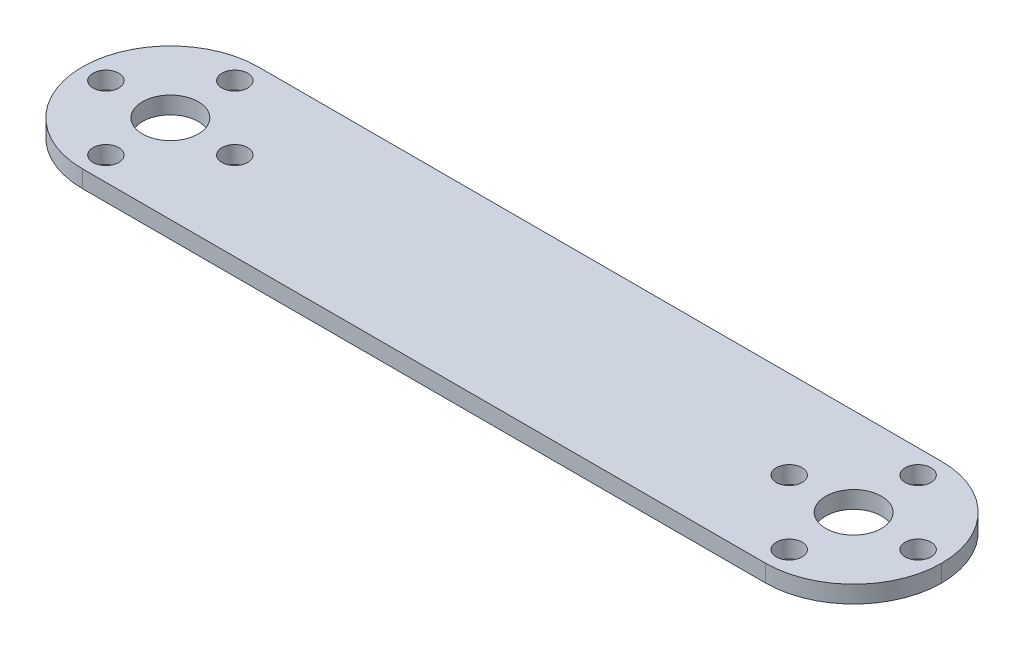
ISO-10303-21;
HEADER;
FILE_DESCRIPTION(('STEP AP214'),'2;1');
FILE_NAME('part.step','',(''),(''),'','','');
FILE_SCHEMA(('AUTOMOTIVE_DESIGN { 1 0 10303 214 1 1 1 1 }'));
ENDSEC;
DATA;
#1=APPLICATION_CONTEXT('core data for automotive mechanical design processes');
#2=APPLICATION_PROTOCOL_DEFINITION('international standard','automotive_design',2000,#1);
#3=PRODUCT_CONTEXT('',#1,'mechanical');
#4=PRODUCT('Part','Part','',(#3));
#5=PRODUCT_RELATED_PRODUCT_CATEGORY('part','',(#4));
#6=PRODUCT_DEFINITION_FORMATION('','',#4);
#7=PRODUCT_DEFINITION_CONTEXT('part definition',#1,'design');
#8=PRODUCT_DEFINITION('design','',#6,#7);
#9=PRODUCT_DEFINITION_SHAPE('','',#8);
#10=(LENGTH_UNIT() NAMED_UNIT(*) SI_UNIT(.MILLI.,.METRE.));
#11=(NAMED_UNIT(*) PLANE_ANGLE_UNIT() SI_UNIT($,.RADIAN.));
#12=(NAMED_UNIT(*) SI_UNIT($,.STERADIAN.) SOLID_ANGLE_UNIT());
#13=UNCERTAINTY_MEASURE_WITH_UNIT(LENGTH_MEASURE(1.E-05),#10,'distance_accuracy_value','');
#14=(GEOMETRIC_REPRESENTATION_CONTEXT(3) GLOBAL_UNCERTAINTY_ASSIGNED_CONTEXT((#13)) GLOBAL_UNIT_ASSIGNED_CONTEXT((#10,
#11,#12)) REPRESENTATION_CONTEXT('',''));
#15=CARTESIAN_POINT('',(0.,0.,0.));
#16=DIRECTION('',(0.,0.,1.));
#17=DIRECTION('',(1.,0.,0.));
#18=AXIS2_PLACEMENT_3D('',#15,#16,#17);
#19=CARTESIAN_POINT('',(0.,2.,0.));
#20=DIRECTION('',(0.,-1.,0.));
#21=DIRECTION('',(0.,0.,-1.));
#22=AXIS2_PLACEMENT_3D('',#19,#20,#21);
#23=PLANE('',#22);
#24=CARTESIAN_POINT('',(10.25,2.,-10.25));
#25=DIRECTION('',(0.,-1.,0.));
#26=DIRECTION('',(0.,0.,-1.));
#27=AXIS2_PLACEMENT_3D('',#24,#25,#26);
#28=CIRCLE('',#27,10.25);
#29=CARTESIAN_POINT('',(10.25,2.,-20.5));
#30=VERTEX_POINT('',#29);
#31=CARTESIAN_POINT('',(0.,2.,-10.25));
#32=VERTEX_POINT('',#31);
#33=EDGE_CURVE('E132',#30,#32,#28,.F.);
#34=ORIENTED_EDGE('',*,*,#33,.T.);
#35=CARTESIAN_POINT('',(10.25,2.,-10.25));
#36=DIRECTION('',(0.,-1.,0.));
#37=DIRECTION('',(0.,0.,-1.));
#38=AXIS2_PLACEMENT_3D('',#35,#36,#37);
#39=CIRCLE('',#38,10.25);
#40=CARTESIAN_POINT('',(10.25,2.,0.));
#41=VERTEX_POINT('',#40);
#42=EDGE_CURVE('E134',#32,#41,#39,.F.);
#43=ORIENTED_EDGE('',*,*,#42,.T.);
#44=DIRECTION('',(1.,0.,0.));
#45=VECTOR('',#44,1.);
#46=CARTESIAN_POINT('',(0.,2.,0.));
#47=LINE('',#46,#45);
#48=CARTESIAN_POINT('',(89.75,2.,0.));
#49=VERTEX_POINT('',#48);
#50=EDGE_CURVE('E107',#41,#49,#47,.T.);
#51=ORIENTED_EDGE('',*,*,#50,.T.);
#52=CARTESIAN_POINT('',(89.75,2.,-10.25));
#53=DIRECTION('',(0.,-1.,0.));
#54=DIRECTION('',(0.,0.,-1.));
#55=AXIS2_PLACEMENT_3D('',#52,#53,#54);
#56=CIRCLE('',#55,10.25);
#57=CARTESIAN_POINT('',(100.,2.,-10.25));
#58=VERTEX_POINT('',#57);
#59=EDGE_CURVE('E97',#49,#58,#56,.F.);
#60=ORIENTED_EDGE('',*,*,#59,.T.);
#61=CARTESIAN_POINT('',(89.75,2.,-10.25));
#62=DIRECTION('',(0.,-1.,0.));
#63=DIRECTION('',(0.,0.,-1.));
#64=AXIS2_PLACEMENT_3D('',#61,#62,#63);
#65=CIRCLE('',#64,10.25);
#66=CARTESIAN_POINT('',(89.75,2.,-20.5));
#67=VERTEX_POINT('',#66);
#68=EDGE_CURVE('E55',#58,#67,#65,.F.);
#69=ORIENTED_EDGE('',*,*,#68,.T.);
#70=DIRECTION('',(-1.,0.,0.));
#71=VECTOR('',#70,1.);
#72=CARTESIAN_POINT('',(0.,2.,-20.5));
#73=LINE('',#72,#71);
#74=EDGE_CURVE('E122',#67,#30,#73,.T.);
#75=ORIENTED_EDGE('',*,*,#74,.T.);
#76=EDGE_LOOP('',(#34,#43,#51,#60,#69,#75));
#77=FACE_BOUND('',#76,.T.);
#78=CARTESIAN_POINT('',(10.25,2.,-10.25));
#79=DIRECTION('',(0.,1.,0.));
#80=DIRECTION('',(0.,0.,1.));
#81=AXIS2_PLACEMENT_3D('',#78,#79,#80);
#82=CIRCLE('',#81,3.25);
#83=CARTESIAN_POINT('',(10.25,2.,-7.));
#84=VERTEX_POINT('',#83);
#85=EDGE_CURVE('E115',#84,#84,#82,.T.);
#86=ORIENTED_EDGE('',*,*,#85,.F.);
#87=EDGE_LOOP('',(#86));
#88=FACE_BOUND('',#87,.T.);
#89=CARTESIAN_POINT('',(17.75,2.,-10.25));
#90=DIRECTION('',(0.,1.,0.));
#91=DIRECTION('',(0.,0.,1.));
#92=AXIS2_PLACEMENT_3D('',#89,#90,#91);
#93=CIRCLE('',#92,1.5);
#94=CARTESIAN_POINT('',(17.75,2.,-8.75));
#95=VERTEX_POINT('',#94);
#96=EDGE_CURVE('E151',#95,#95,#93,.T.);
#97=ORIENTED_EDGE('',*,*,#96,.F.);
#98=EDGE_LOOP('',(#97));
#99=FACE_BOUND('',#98,.T.);
#100=CARTESIAN_POINT('',(10.25,2.,-17.75));
#101=DIRECTION('',(0.,1.,0.));
#102=DIRECTION('',(0.,0.,-1.));
#103=AXIS2_PLACEMENT_3D('',#100,#101,#102);
#104=CIRCLE('',#103,1.5);
#105=CARTESIAN_POINT('',(10.25,2.,-19.25));
#106=VERTEX_POINT('',#105);
#107=EDGE_CURVE('E156',#106,#106,#104,.T.);
#108=ORIENTED_EDGE('',*,*,#107,.F.);
#109=EDGE_LOOP('',(#108));
#110=FACE_BOUND('',#109,.T.);
#111=CARTESIAN_POINT('',(10.25,2.,-2.75));
#112=DIRECTION('',(0.,1.,0.));
#113=DIRECTION('',(0.,0.,-1.));
#114=AXIS2_PLACEMENT_3D('',#111,#112,#113);
#115=CIRCLE('',#114,1.5);
#116=CARTESIAN_POINT('',(10.25,2.,-4.25));
#117=VERTEX_POINT('',#116);
#118=EDGE_CURVE('E162',#117,#117,#115,.T.);
#119=ORIENTED_EDGE('',*,*,#118,.F.);
#120=EDGE_LOOP('',(#119));
#121=FACE_BOUND('',#120,.T.);
#122=CARTESIAN_POINT('',(2.75,2.,-10.25));
#123=DIRECTION('',(0.,1.,0.));
#124=DIRECTION('',(0.,0.,1.));
#125=AXIS2_PLACEMENT_3D('',#122,#123,#124);
#126=CIRCLE('',#125,1.5);
#127=CARTESIAN_POINT('',(2.75,2.,-8.75));
#128=VERTEX_POINT('',#127);
#129=EDGE_CURVE('E168',#128,#128,#126,.T.);
#130=ORIENTED_EDGE('',*,*,#129,.F.);
#131=EDGE_LOOP('',(#130));
#132=FACE_BOUND('',#131,.T.);
#133=CARTESIAN_POINT('',(82.25,2.,-10.25));
#134=DIRECTION('',(0.,1.,0.));
#135=DIRECTION('',(0.,0.,-1.));
#136=AXIS2_PLACEMENT_3D('',#133,#134,#135);
#137=CIRCLE('',#136,1.5);
#138=CARTESIAN_POINT('',(82.25,2.,-11.75));
#139=VERTEX_POINT('',#138);
#140=EDGE_CURVE('E174',#139,#139,#137,.T.);
#141=ORIENTED_EDGE('',*,*,#140,.F.);
#142=EDGE_LOOP('',(#141));
#143=FACE_BOUND('',#142,.T.);
#144=CARTESIAN_POINT('',(89.75,2.,-17.75));
#145=DIRECTION('',(0.,1.,0.));
#146=DIRECTION('',(0.,0.,1.));
#147=AXIS2_PLACEMENT_3D('',#144,#145,#146);
#148=CIRCLE('',#147,1.5);
#149=CARTESIAN_POINT('',(89.75,2.,-16.25));
#150=VERTEX_POINT('',#149);
#151=EDGE_CURVE('E180',#150,#150,#148,.T.);
#152=ORIENTED_EDGE('',*,*,#151,.F.);
#153=EDGE_LOOP('',(#152));
#154=FACE_BOUND('',#153,.T.);
#155=CARTESIAN_POINT('',(89.75,2.,-2.75));
#156=DIRECTION('',(0.,1.,0.));
#157=DIRECTION('',(0.,0.,1.));
#158=AXIS2_PLACEMENT_3D('',#155,#156,#157);
#159=CIRCLE('',#158,1.5);
#160=CARTESIAN_POINT('',(89.75,2.,-1.25));
#161=VERTEX_POINT('',#160);
#162=EDGE_CURVE('E186',#161,#161,#159,.T.);
#163=ORIENTED_EDGE('',*,*,#162,.F.);
#164=EDGE_LOOP('',(#163));
#165=FACE_BOUND('',#164,.T.);
#166=CARTESIAN_POINT('',(97.25,2.,-10.25));
#167=DIRECTION('',(0.,1.,0.));
#168=DIRECTION('',(0.,0.,-1.));
#169=AXIS2_PLACEMENT_3D('',#166,#167,#168);
#170=CIRCLE('',#169,1.5);
#171=CARTESIAN_POINT('',(97.25,2.,-11.75));
#172=VERTEX_POINT('',#171);
#173=EDGE_CURVE('E192',#172,#172,#170,.T.);
#174=ORIENTED_EDGE('',*,*,#173,.F.);
#175=EDGE_LOOP('',(#174));
#176=FACE_BOUND('',#175,.T.);
#177=CARTESIAN_POINT('',(89.75,2.,-10.25));
#178=DIRECTION('',(0.,1.,0.));
#179=DIRECTION('',(0.,0.,-1.));
#180=AXIS2_PLACEMENT_3D('',#177,#178,#179);
#181=CIRCLE('',#180,3.24999999999999);
#182=CARTESIAN_POINT('',(89.75,2.,-13.5));
#183=VERTEX_POINT('',#182);
#184=EDGE_CURVE('E139',#183,#183,#181,.T.);
#185=ORIENTED_EDGE('',*,*,#184,.F.);
#186=EDGE_LOOP('',(#185));
#187=FACE_BOUND('',#186,.T.);
#188=ADVANCED_FACE('F33',(#77,#88,#99,#110,#121,#132,#143,#154,#165,#176,#187),#23,.F.);
#189=CARTESIAN_POINT('',(0.,0.,0.));
#190=DIRECTION('',(0.,-1.,0.));
#191=DIRECTION('',(0.,0.,-1.));
#192=AXIS2_PLACEMENT_3D('',#189,#190,#191);
#193=PLANE('',#192);
#194=CARTESIAN_POINT('',(97.25,0.,-10.25));
#195=DIRECTION('',(0.,1.,0.));
#196=DIRECTION('',(0.,0.,-1.));
#197=AXIS2_PLACEMENT_3D('',#194,#195,#196);
#198=CIRCLE('',#197,1.5);
#199=CARTESIAN_POINT('',(97.25,0.,-11.75));
#200=VERTEX_POINT('',#199);
#201=EDGE_CURVE('E195',#200,#200,#198,.T.);
#202=ORIENTED_EDGE('',*,*,#201,.T.);
#203=EDGE_LOOP('',(#202));
#204=FACE_BOUND('',#203,.T.);
#205=CARTESIAN_POINT('',(89.75,0.,-17.75));
#206=DIRECTION('',(0.,1.,0.));
#207=DIRECTION('',(0.,0.,1.));
#208=AXIS2_PLACEMENT_3D('',#205,#206,#207);
#209=CIRCLE('',#208,1.5);
#210=CARTESIAN_POINT('',(89.75,0.,-16.25));
#211=VERTEX_POINT('',#210);
#212=EDGE_CURVE('E183',#211,#211,#209,.T.);
#213=ORIENTED_EDGE('',*,*,#212,.T.);
#214=EDGE_LOOP('',(#213));
#215=FACE_BOUND('',#214,.T.);
#216=CARTESIAN_POINT('',(2.75,0.,-10.25));
#217=DIRECTION('',(0.,1.,0.));
#218=DIRECTION('',(0.,0.,1.));
#219=AXIS2_PLACEMENT_3D('',#216,#217,#218);
#220=CIRCLE('',#219,1.5);
#221=CARTESIAN_POINT('',(2.75,0.,-8.75));
#222=VERTEX_POINT('',#221);
#223=EDGE_CURVE('E171',#222,#222,#220,.T.);
#224=ORIENTED_EDGE('',*,*,#223,.T.);
#225=EDGE_LOOP('',(#224));
#226=FACE_BOUND('',#225,.T.);
#227=CARTESIAN_POINT('',(10.25,0.,-17.75));
#228=DIRECTION('',(0.,1.,0.));
#229=DIRECTION('',(0.,0.,-1.));
#230=AXIS2_PLACEMENT_3D('',#227,#228,#229);
#231=CIRCLE('',#230,1.5);
#232=CARTESIAN_POINT('',(10.25,0.,-19.25));
#233=VERTEX_POINT('',#232);
#234=EDGE_CURVE('E159',#233,#233,#231,.T.);
#235=ORIENTED_EDGE('',*,*,#234,.T.);
#236=EDGE_LOOP('',(#235));
#237=FACE_BOUND('',#236,.T.);
#238=CARTESIAN_POINT('',(10.25,0.,-10.25));
#239=DIRECTION('',(0.,1.,0.));
#240=DIRECTION('',(0.,0.,1.));
#241=AXIS2_PLACEMENT_3D('',#238,#239,#240);
#242=CIRCLE('',#241,3.25);
#243=CARTESIAN_POINT('',(10.25,0.,-7.));
#244=VERTEX_POINT('',#243);
#245=EDGE_CURVE('E119',#244,#244,#242,.T.);
#246=ORIENTED_EDGE('',*,*,#245,.T.);
#247=EDGE_LOOP('',(#246));
#248=FACE_BOUND('',#247,.T.);
#249=DIRECTION('',(1.,0.,0.));
#250=VECTOR('',#249,1.);
#251=CARTESIAN_POINT('',(0.,0.,0.));
#252=LINE('',#251,#250);
#253=CARTESIAN_POINT('',(10.25,0.,0.));
#254=VERTEX_POINT('',#253);
#255=CARTESIAN_POINT('',(89.75,0.,0.));
#256=VERTEX_POINT('',#255);
#257=EDGE_CURVE('E104',#254,#256,#252,.T.);
#258=ORIENTED_EDGE('',*,*,#257,.F.);
#259=CARTESIAN_POINT('',(10.25,0.,-10.25));
#260=DIRECTION('',(0.,-1.,0.));
#261=DIRECTION('',(0.,0.,-1.));
#262=AXIS2_PLACEMENT_3D('',#259,#260,#261);
#263=CIRCLE('',#262,10.25);
#264=CARTESIAN_POINT('',(0.,0.,-10.25));
#265=VERTEX_POINT('',#264);
#266=EDGE_CURVE('E87',#254,#265,#263,.T.);
#267=ORIENTED_EDGE('',*,*,#266,.T.);
#268=CARTESIAN_POINT('',(10.25,0.,-10.25));
#269=DIRECTION('',(0.,-1.,0.));
#270=DIRECTION('',(0.,0.,-1.));
#271=AXIS2_PLACEMENT_3D('',#268,#269,#270);
#272=CIRCLE('',#271,10.25);
#273=CARTESIAN_POINT('',(10.25,0.,-20.5));
#274=VERTEX_POINT('',#273);
#275=EDGE_CURVE('E98',#265,#274,#272,.T.);
#276=ORIENTED_EDGE('',*,*,#275,.T.);
#277=DIRECTION('',(-1.,0.,0.));
#278=VECTOR('',#277,1.);
#279=CARTESIAN_POINT('',(0.,0.,-20.5));
#280=LINE('',#279,#278);
#281=CARTESIAN_POINT('',(89.75,0.,-20.5));
#282=VERTEX_POINT('',#281);
#283=EDGE_CURVE('E114',#282,#274,#280,.T.);
#284=ORIENTED_EDGE('',*,*,#283,.F.);
#285=CARTESIAN_POINT('',(89.75,0.,-10.25));
#286=DIRECTION('',(0.,-1.,0.));
#287=DIRECTION('',(0.,0.,-1.));
#288=AXIS2_PLACEMENT_3D('',#285,#286,#287);
#289=CIRCLE('',#288,10.25);
#290=CARTESIAN_POINT('',(100.,0.,-10.25));
#291=VERTEX_POINT('',#290);
#292=EDGE_CURVE('E127',#282,#291,#289,.T.);
#293=ORIENTED_EDGE('',*,*,#292,.T.);
#294=CARTESIAN_POINT('',(89.75,0.,-10.25));
#295=DIRECTION('',(0.,-1.,0.));
#296=DIRECTION('',(0.,0.,-1.));
#297=AXIS2_PLACEMENT_3D('',#294,#295,#296);
#298=CIRCLE('',#297,10.25);
#299=EDGE_CURVE('E108',#291,#256,#298,.T.);
#300=ORIENTED_EDGE('',*,*,#299,.T.);
#301=EDGE_LOOP('',(#258,#267,#276,#284,#293,#300));
#302=FACE_BOUND('',#301,.T.);
#303=CARTESIAN_POINT('',(17.75,0.,-10.25));
#304=DIRECTION('',(0.,1.,0.));
#305=DIRECTION('',(0.,0.,1.));
#306=AXIS2_PLACEMENT_3D('',#303,#304,#305);
#307=CIRCLE('',#306,1.5);
#308=CARTESIAN_POINT('',(17.75,0.,-8.75));
#309=VERTEX_POINT('',#308);
#310=EDGE_CURVE('E153',#309,#309,#307,.T.);
#311=ORIENTED_EDGE('',*,*,#310,.T.);
#312=EDGE_LOOP('',(#311));
#313=FACE_BOUND('',#312,.T.);
#314=CARTESIAN_POINT('',(10.25,0.,-2.75));
#315=DIRECTION('',(0.,1.,0.));
#316=DIRECTION('',(0.,0.,-1.));
#317=AXIS2_PLACEMENT_3D('',#314,#315,#316);
#318=CIRCLE('',#317,1.5);
#319=CARTESIAN_POINT('',(10.25,0.,-4.25));
#320=VERTEX_POINT('',#319);
#321=EDGE_CURVE('E165',#320,#320,#318,.T.);
#322=ORIENTED_EDGE('',*,*,#321,.T.);
#323=EDGE_LOOP('',(#322));
#324=FACE_BOUND('',#323,.T.);
#325=CARTESIAN_POINT('',(82.25,0.,-10.25));
#326=DIRECTION('',(0.,1.,0.));
#327=DIRECTION('',(0.,0.,-1.));
#328=AXIS2_PLACEMENT_3D('',#325,#326,#327);
#329=CIRCLE('',#328,1.5);
#330=CARTESIAN_POINT('',(82.25,0.,-11.75));
#331=VERTEX_POINT('',#330);
#332=EDGE_CURVE('E177',#331,#331,#329,.T.);
#333=ORIENTED_EDGE('',*,*,#332,.T.);
#334=EDGE_LOOP('',(#333));
#335=FACE_BOUND('',#334,.T.);
#336=CARTESIAN_POINT('',(89.75,0.,-2.75));
#337=DIRECTION('',(0.,1.,0.));
#338=DIRECTION('',(0.,0.,1.));
#339=AXIS2_PLACEMENT_3D('',#336,#337,#338);
#340=CIRCLE('',#339,1.5);
#341=CARTESIAN_POINT('',(89.75,0.,-1.25));
#342=VERTEX_POINT('',#341);
#343=EDGE_CURVE('E189',#342,#342,#340,.T.);
#344=ORIENTED_EDGE('',*,*,#343,.T.);
#345=EDGE_LOOP('',(#344));
#346=FACE_BOUND('',#345,.T.);
#347=CARTESIAN_POINT('',(89.75,0.,-10.25));
#348=DIRECTION('',(0.,1.,0.));
#349=DIRECTION('',(0.,0.,-1.));
#350=AXIS2_PLACEMENT_3D('',#347,#348,#349);
#351=CIRCLE('',#350,3.24999999999999);
#352=CARTESIAN_POINT('',(89.75,0.,-13.5));
#353=VERTEX_POINT('',#352);
#354=EDGE_CURVE('E137',#353,#353,#351,.T.);
#355=ORIENTED_EDGE('',*,*,#354,.T.);
#356=EDGE_LOOP('',(#355));
#357=FACE_BOUND('',#356,.T.);
#358=ADVANCED_FACE('F111',(#204,#215,#226,#237,#248,#302,#313,#324,#335,#346,#357),#193,.T.);
#359=CARTESIAN_POINT('',(0.,2.,0.));
#360=DIRECTION('',(0.,0.,-1.));
#361=DIRECTION('',(-1.,0.,0.));
#362=AXIS2_PLACEMENT_3D('',#359,#360,#361);
#363=PLANE('',#362);
#364=ORIENTED_EDGE('',*,*,#50,.F.);
#365=DIRECTION('',(0.,-1.,0.));
#366=VECTOR('',#365,1.);
#367=CARTESIAN_POINT('',(10.25,2.,0.));
#368=LINE('',#367,#366);
#369=EDGE_CURVE('E91',#41,#254,#368,.T.);
#370=ORIENTED_EDGE('',*,*,#369,.T.);
#371=ORIENTED_EDGE('',*,*,#257,.T.);
#372=DIRECTION('',(0.,-1.,0.));
#373=VECTOR('',#372,1.);
#374=CARTESIAN_POINT('',(89.75,2.,0.));
#375=LINE('',#374,#373);
#376=EDGE_CURVE('E109',#256,#49,#375,.F.);
#377=ORIENTED_EDGE('',*,*,#376,.T.);
#378=EDGE_LOOP('',(#364,#370,#371,#377));
#379=FACE_BOUND('',#378,.T.);
#380=ADVANCED_FACE('F103',(#379),#363,.F.);
#381=CARTESIAN_POINT('',(0.,2.,-20.5));
#382=DIRECTION('',(0.,0.,1.));
#383=DIRECTION('',(1.,0.,0.));
#384=AXIS2_PLACEMENT_3D('',#381,#382,#383);
#385=PLANE('',#384);
#386=ORIENTED_EDGE('',*,*,#283,.T.);
#387=DIRECTION('',(0.,-1.,0.));
#388=VECTOR('',#387,1.);
#389=CARTESIAN_POINT('',(10.25,2.,-20.5));
#390=LINE('',#389,#388);
#391=EDGE_CURVE('E11',#274,#30,#390,.F.);
#392=ORIENTED_EDGE('',*,*,#391,.T.);
#393=ORIENTED_EDGE('',*,*,#74,.F.);
#394=DIRECTION('',(0.,-1.,0.));
#395=VECTOR('',#394,1.);
#396=CARTESIAN_POINT('',(89.75,2.,-20.5));
#397=LINE('',#396,#395);
#398=EDGE_CURVE('E42',#67,#282,#397,.T.);
#399=ORIENTED_EDGE('',*,*,#398,.T.);
#400=EDGE_LOOP('',(#386,#392,#393,#399));
#401=FACE_BOUND('',#400,.T.);
#402=ADVANCED_FACE('F217',(#401),#385,.F.);
#403=CARTESIAN_POINT('',(10.25,2.,-10.25));
#404=DIRECTION('',(0.,-1.,0.));
#405=DIRECTION('',(0.,0.,-1.));
#406=AXIS2_PLACEMENT_3D('',#403,#404,#405);
#407=CYLINDRICAL_SURFACE('',#406,3.25);
#408=ORIENTED_EDGE('',*,*,#85,.T.);
#409=EDGE_LOOP('',(#408));
#410=FACE_BOUND('',#409,.T.);
#411=ORIENTED_EDGE('',*,*,#245,.F.);
#412=EDGE_LOOP('',(#411));
#413=FACE_BOUND('',#412,.T.);
#414=ADVANCED_FACE('F214',(#410,#413),#407,.F.);
#415=CARTESIAN_POINT('',(17.75,2.,-10.25));
#416=DIRECTION('',(0.,-1.,0.));
#417=DIRECTION('',(0.,0.,-1.));
#418=AXIS2_PLACEMENT_3D('',#415,#416,#417);
#419=CYLINDRICAL_SURFACE('',#418,1.5);
#420=ORIENTED_EDGE('',*,*,#96,.T.);
#421=EDGE_LOOP('',(#420));
#422=FACE_BOUND('',#421,.T.);
#423=ORIENTED_EDGE('',*,*,#310,.F.);
#424=EDGE_LOOP('',(#423));
#425=FACE_BOUND('',#424,.T.);
#426=ADVANCED_FACE('F303',(#422,#425),#419,.F.);
#427=CARTESIAN_POINT('',(10.25,2.,-17.75));
#428=DIRECTION('',(0.,-1.,0.));
#429=DIRECTION('',(0.,0.,-1.));
#430=AXIS2_PLACEMENT_3D('',#427,#428,#429);
#431=CYLINDRICAL_SURFACE('',#430,1.5);
#432=ORIENTED_EDGE('',*,*,#107,.T.);
#433=EDGE_LOOP('',(#432));
#434=FACE_BOUND('',#433,.T.);
#435=ORIENTED_EDGE('',*,*,#234,.F.);
#436=EDGE_LOOP('',(#435));
#437=FACE_BOUND('',#436,.T.);
#438=ADVANCED_FACE('F295',(#434,#437),#431,.F.);
#439=CARTESIAN_POINT('',(10.25,2.,-2.75));
#440=DIRECTION('',(0.,-1.,0.));
#441=DIRECTION('',(0.,0.,-1.));
#442=AXIS2_PLACEMENT_3D('',#439,#440,#441);
#443=CYLINDRICAL_SURFACE('',#442,1.5);
#444=ORIENTED_EDGE('',*,*,#118,.T.);
#445=EDGE_LOOP('',(#444));
#446=FACE_BOUND('',#445,.T.);
#447=ORIENTED_EDGE('',*,*,#321,.F.);
#448=EDGE_LOOP('',(#447));
#449=FACE_BOUND('',#448,.T.);
#450=ADVANCED_FACE('F287',(#446,#449),#443,.F.);
#451=CARTESIAN_POINT('',(2.75,2.,-10.25));
#452=DIRECTION('',(0.,-1.,0.));
#453=DIRECTION('',(0.,0.,-1.));
#454=AXIS2_PLACEMENT_3D('',#451,#452,#453);
#455=CYLINDRICAL_SURFACE('',#454,1.5);
#456=ORIENTED_EDGE('',*,*,#129,.T.);
#457=EDGE_LOOP('',(#456));
#458=FACE_BOUND('',#457,.T.);
#459=ORIENTED_EDGE('',*,*,#223,.F.);
#460=EDGE_LOOP('',(#459));
#461=FACE_BOUND('',#460,.T.);
#462=ADVANCED_FACE('F279',(#458,#461),#455,.F.);
#463=CARTESIAN_POINT('',(82.25,2.,-10.25));
#464=DIRECTION('',(0.,-1.,0.));
#465=DIRECTION('',(0.,0.,-1.));
#466=AXIS2_PLACEMENT_3D('',#463,#464,#465);
#467=CYLINDRICAL_SURFACE('',#466,1.5);
#468=ORIENTED_EDGE('',*,*,#140,.T.);
#469=EDGE_LOOP('',(#468));
#470=FACE_BOUND('',#469,.T.);
#471=ORIENTED_EDGE('',*,*,#332,.F.);
#472=EDGE_LOOP('',(#471));
#473=FACE_BOUND('',#472,.T.);
#474=ADVANCED_FACE('F271',(#470,#473),#467,.F.);
#475=CARTESIAN_POINT('',(89.75,2.,-17.75));
#476=DIRECTION('',(0.,-1.,0.));
#477=DIRECTION('',(0.,0.,-1.));
#478=AXIS2_PLACEMENT_3D('',#475,#476,#477);
#479=CYLINDRICAL_SURFACE('',#478,1.5);
#480=ORIENTED_EDGE('',*,*,#151,.T.);
#481=EDGE_LOOP('',(#480));
#482=FACE_BOUND('',#481,.T.);
#483=ORIENTED_EDGE('',*,*,#212,.F.);
#484=EDGE_LOOP('',(#483));
#485=FACE_BOUND('',#484,.T.);
#486=ADVANCED_FACE('F263',(#482,#485),#479,.F.);
#487=CARTESIAN_POINT('',(89.75,2.,-2.75));
#488=DIRECTION('',(0.,-1.,0.));
#489=DIRECTION('',(0.,0.,-1.));
#490=AXIS2_PLACEMENT_3D('',#487,#488,#489);
#491=CYLINDRICAL_SURFACE('',#490,1.5);
#492=ORIENTED_EDGE('',*,*,#162,.T.);
#493=EDGE_LOOP('',(#492));
#494=FACE_BOUND('',#493,.T.);
#495=ORIENTED_EDGE('',*,*,#343,.F.);
#496=EDGE_LOOP('',(#495));
#497=FACE_BOUND('',#496,.T.);
#498=ADVANCED_FACE('F255',(#494,#497),#491,.F.);
#499=CARTESIAN_POINT('',(97.25,2.,-10.25));
#500=DIRECTION('',(0.,-1.,0.));
#501=DIRECTION('',(0.,0.,-1.));
#502=AXIS2_PLACEMENT_3D('',#499,#500,#501);
#503=CYLINDRICAL_SURFACE('',#502,1.5);
#504=ORIENTED_EDGE('',*,*,#173,.T.);
#505=EDGE_LOOP('',(#504));
#506=FACE_BOUND('',#505,.T.);
#507=ORIENTED_EDGE('',*,*,#201,.F.);
#508=EDGE_LOOP('',(#507));
#509=FACE_BOUND('',#508,.T.);
#510=ADVANCED_FACE('F248',(#506,#509),#503,.F.);
#511=CARTESIAN_POINT('',(89.75,2.,-10.25));
#512=DIRECTION('',(0.,-1.,0.));
#513=DIRECTION('',(0.,0.,-1.));
#514=AXIS2_PLACEMENT_3D('',#511,#512,#513);
#515=CYLINDRICAL_SURFACE('',#514,3.24999999999999);
#516=ORIENTED_EDGE('',*,*,#184,.T.);
#517=EDGE_LOOP('',(#516));
#518=FACE_BOUND('',#517,.T.);
#519=ORIENTED_EDGE('',*,*,#354,.F.);
#520=EDGE_LOOP('',(#519));
#521=FACE_BOUND('',#520,.T.);
#522=ADVANCED_FACE('F203',(#518,#521),#515,.F.);
#523=CARTESIAN_POINT('',(10.25,2.,-10.25));
#524=DIRECTION('',(0.,-1.,0.));
#525=DIRECTION('',(0.,0.,-1.));
#526=AXIS2_PLACEMENT_3D('',#523,#524,#525);
#527=CYLINDRICAL_SURFACE('',#526,10.25);
#528=DIRECTION('',(0.,-1.,0.));
#529=VECTOR('',#528,1.);
#530=CARTESIAN_POINT('',(0.,2.,-10.25));
#531=LINE('',#530,#529);
#532=EDGE_CURVE('E93',#32,#265,#531,.T.);
#533=ORIENTED_EDGE('',*,*,#532,.F.);
#534=ORIENTED_EDGE('',*,*,#33,.F.);
#535=ORIENTED_EDGE('',*,*,#391,.F.);
#536=ORIENTED_EDGE('',*,*,#275,.F.);
#537=EDGE_LOOP('',(#533,#534,#535,#536));
#538=FACE_BOUND('',#537,.T.);
#539=ADVANCED_FACE('F224',(#538),#527,.T.);
#540=CARTESIAN_POINT('',(10.25,2.,-10.25));
#541=DIRECTION('',(0.,-1.,0.));
#542=DIRECTION('',(0.,0.,-1.));
#543=AXIS2_PLACEMENT_3D('',#540,#541,#542);
#544=CYLINDRICAL_SURFACE('',#543,10.25);
#545=ORIENTED_EDGE('',*,*,#42,.F.);
#546=ORIENTED_EDGE('',*,*,#532,.T.);
#547=ORIENTED_EDGE('',*,*,#266,.F.);
#548=ORIENTED_EDGE('',*,*,#369,.F.);
#549=EDGE_LOOP('',(#545,#546,#547,#548));
#550=FACE_BOUND('',#549,.T.);
#551=ADVANCED_FACE('F90',(#550),#544,.T.);
#552=CARTESIAN_POINT('',(89.75,2.,-10.25));
#553=DIRECTION('',(0.,-1.,0.));
#554=DIRECTION('',(0.,0.,-1.));
#555=AXIS2_PLACEMENT_3D('',#552,#553,#554);
#556=CYLINDRICAL_SURFACE('',#555,10.25);
#557=DIRECTION('',(0.,-1.,0.));
#558=VECTOR('',#557,1.);
#559=CARTESIAN_POINT('',(100.,2.,-10.25));
#560=LINE('',#559,#558);
#561=EDGE_CURVE('E37',#58,#291,#560,.T.);
#562=ORIENTED_EDGE('',*,*,#561,.F.);
#563=ORIENTED_EDGE('',*,*,#59,.F.);
#564=ORIENTED_EDGE('',*,*,#376,.F.);
#565=ORIENTED_EDGE('',*,*,#299,.F.);
#566=EDGE_LOOP('',(#562,#563,#564,#565));
#567=FACE_BOUND('',#566,.T.);
#568=ADVANCED_FACE('F35',(#567),#556,.T.);
#569=CARTESIAN_POINT('',(89.75,2.,-10.25));
#570=DIRECTION('',(0.,-1.,0.));
#571=DIRECTION('',(0.,0.,-1.));
#572=AXIS2_PLACEMENT_3D('',#569,#570,#571);
#573=CYLINDRICAL_SURFACE('',#572,10.25);
#574=ORIENTED_EDGE('',*,*,#68,.F.);
#575=ORIENTED_EDGE('',*,*,#561,.T.);
#576=ORIENTED_EDGE('',*,*,#292,.F.);
#577=ORIENTED_EDGE('',*,*,#398,.F.);
#578=EDGE_LOOP('',(#574,#575,#576,#577));
#579=FACE_BOUND('',#578,.T.);
#580=ADVANCED_FACE('F144',(#579),#573,.T.);
#581=CLOSED_SHELL('',(#188,#358,#380,#402,#414,#426,#438,#450,#462,#474,#486,#498,#510,#522,
#539,#551,#568,#580));
#582=MANIFOLD_SOLID_BREP('B2',#581);
#583=ADVANCED_BREP_SHAPE_REPRESENTATION('',(#18,#582),#14);
#584=SHAPE_DEFINITION_REPRESENTATION(#9,#583);
ENDSEC;
END-ISO-10303-21;
